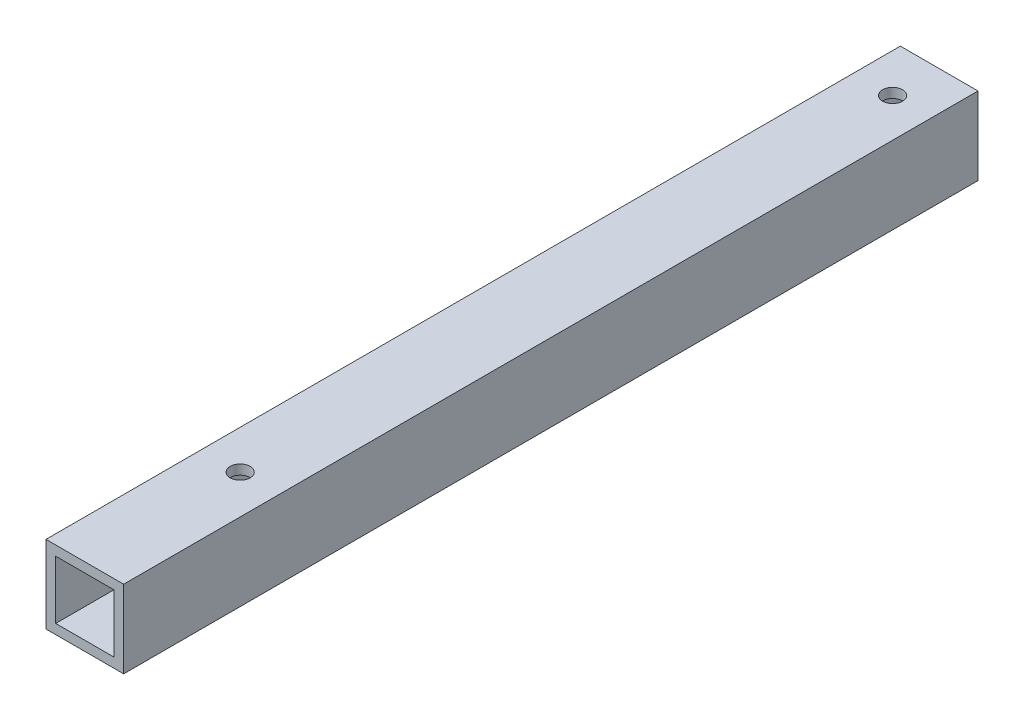
ISO-10303-21;
HEADER;
FILE_DESCRIPTION(('STEP AP214'),'2;1');
FILE_NAME('part.step','',(''),(''),'','','');
FILE_SCHEMA(('AUTOMOTIVE_DESIGN { 1 0 10303 214 1 1 1 1 }'));
ENDSEC;
DATA;
#1=APPLICATION_CONTEXT('core data for automotive mechanical design processes');
#2=APPLICATION_PROTOCOL_DEFINITION('international standard','automotive_design',2000,#1);
#3=PRODUCT_CONTEXT('',#1,'mechanical');
#4=PRODUCT('Part','Part','',(#3));
#5=PRODUCT_RELATED_PRODUCT_CATEGORY('part','',(#4));
#6=PRODUCT_DEFINITION_FORMATION('','',#4);
#7=PRODUCT_DEFINITION_CONTEXT('part definition',#1,'design');
#8=PRODUCT_DEFINITION('design','',#6,#7);
#9=PRODUCT_DEFINITION_SHAPE('','',#8);
#10=(LENGTH_UNIT() NAMED_UNIT(*) SI_UNIT(.MILLI.,.METRE.));
#11=(NAMED_UNIT(*) PLANE_ANGLE_UNIT() SI_UNIT($,.RADIAN.));
#12=(NAMED_UNIT(*) SI_UNIT($,.STERADIAN.) SOLID_ANGLE_UNIT());
#13=UNCERTAINTY_MEASURE_WITH_UNIT(LENGTH_MEASURE(1.E-05),#10,'distance_accuracy_value','');
#14=(GEOMETRIC_REPRESENTATION_CONTEXT(3) GLOBAL_UNCERTAINTY_ASSIGNED_CONTEXT((#13)) GLOBAL_UNIT_ASSIGNED_CONTEXT((#10,
#11,#12)) REPRESENTATION_CONTEXT('',''));
#15=CARTESIAN_POINT('',(0.,0.,0.));
#16=DIRECTION('',(0.,0.,1.));
#17=DIRECTION('',(1.,0.,0.));
#18=AXIS2_PLACEMENT_3D('',#15,#16,#17);
#19=CARTESIAN_POINT('',(0.,0.,279.4));
#20=DIRECTION('',(0.,0.,-1.));
#21=DIRECTION('',(-1.,0.,0.));
#22=AXIS2_PLACEMENT_3D('',#19,#20,#21);
#23=PLANE('',#22);
#24=DIRECTION('',(-1.,0.,0.));
#25=VECTOR('',#24,1.);
#26=CARTESIAN_POINT('',(12.7000000000001,-12.7,279.4));
#27=LINE('',#26,#25);
#28=CARTESIAN_POINT('',(12.7000000000001,-12.7,279.4));
#29=VERTEX_POINT('',#28);
#30=CARTESIAN_POINT('',(-12.6999999999999,-12.7,279.4));
#31=VERTEX_POINT('',#30);
#32=EDGE_CURVE('E140',#29,#31,#27,.T.);
#33=ORIENTED_EDGE('',*,*,#32,.F.);
#34=DIRECTION('',(0.,1.,0.));
#35=VECTOR('',#34,1.);
#36=CARTESIAN_POINT('',(12.7000000000001,-12.7,279.4));
#37=LINE('',#36,#35);
#38=CARTESIAN_POINT('',(12.7000000000001,12.7,279.4));
#39=VERTEX_POINT('',#38);
#40=EDGE_CURVE('E149',#29,#39,#37,.T.);
#41=ORIENTED_EDGE('',*,*,#40,.T.);
#42=DIRECTION('',(-1.,0.,0.));
#43=VECTOR('',#42,1.);
#44=CARTESIAN_POINT('',(12.7000000000001,12.7,279.4));
#45=LINE('',#44,#43);
#46=CARTESIAN_POINT('',(-12.6999999999999,12.7,279.4));
#47=VERTEX_POINT('',#46);
#48=EDGE_CURVE('E147',#39,#47,#45,.T.);
#49=ORIENTED_EDGE('',*,*,#48,.T.);
#50=DIRECTION('',(0.,1.,0.));
#51=VECTOR('',#50,1.);
#52=CARTESIAN_POINT('',(-12.6999999999999,-12.7,279.4));
#53=LINE('',#52,#51);
#54=EDGE_CURVE('E143',#31,#47,#53,.T.);
#55=ORIENTED_EDGE('',*,*,#54,.F.);
#56=EDGE_LOOP('',(#33,#41,#49,#55));
#57=FACE_BOUND('',#56,.T.);
#58=DIRECTION('',(0.,1.,0.));
#59=VECTOR('',#58,1.);
#60=CARTESIAN_POINT('',(9.52500000000005,-9.52499999999999,279.4));
#61=LINE('',#60,#59);
#62=CARTESIAN_POINT('',(9.52500000000005,-9.52499999999999,279.4));
#63=VERTEX_POINT('',#62);
#64=CARTESIAN_POINT('',(9.52500000000005,9.52499999999999,279.4));
#65=VERTEX_POINT('',#64);
#66=EDGE_CURVE('E102',#63,#65,#61,.T.);
#67=ORIENTED_EDGE('',*,*,#66,.F.);
#68=DIRECTION('',(1.,0.,0.));
#69=VECTOR('',#68,1.);
#70=CARTESIAN_POINT('',(-9.52500000000006,-9.52499999999999,279.4));
#71=LINE('',#70,#69);
#72=CARTESIAN_POINT('',(-9.52500000000006,-9.52499999999999,279.4));
#73=VERTEX_POINT('',#72);
#74=EDGE_CURVE('E124',#73,#63,#71,.T.);
#75=ORIENTED_EDGE('',*,*,#74,.F.);
#76=DIRECTION('',(0.,-1.,0.));
#77=VECTOR('',#76,1.);
#78=CARTESIAN_POINT('',(-9.52500000000006,-9.52499999999999,279.4));
#79=LINE('',#78,#77);
#80=CARTESIAN_POINT('',(-9.52500000000006,9.52499999999999,279.4));
#81=VERTEX_POINT('',#80);
#82=EDGE_CURVE('E122',#81,#73,#79,.T.);
#83=ORIENTED_EDGE('',*,*,#82,.F.);
#84=DIRECTION('',(-1.,0.,0.));
#85=VECTOR('',#84,1.);
#86=CARTESIAN_POINT('',(-9.52500000000006,9.52499999999999,279.4));
#87=LINE('',#86,#85);
#88=EDGE_CURVE('E110',#65,#81,#87,.T.);
#89=ORIENTED_EDGE('',*,*,#88,.F.);
#90=EDGE_LOOP('',(#67,#75,#83,#89));
#91=FACE_BOUND('',#90,.T.);
#92=ADVANCED_FACE('F36',(#57,#91),#23,.F.);
#93=CARTESIAN_POINT('',(0.,0.,0.));
#94=DIRECTION('',(0.,0.,-1.));
#95=DIRECTION('',(-1.,0.,0.));
#96=AXIS2_PLACEMENT_3D('',#93,#94,#95);
#97=PLANE('',#96);
#98=DIRECTION('',(-1.,0.,0.));
#99=VECTOR('',#98,1.);
#100=CARTESIAN_POINT('',(12.7000000000001,-12.7,0.));
#101=LINE('',#100,#99);
#102=CARTESIAN_POINT('',(12.7000000000001,-12.7,0.));
#103=VERTEX_POINT('',#102);
#104=CARTESIAN_POINT('',(-12.6999999999999,-12.7,0.));
#105=VERTEX_POINT('',#104);
#106=EDGE_CURVE('E118',#103,#105,#101,.T.);
#107=ORIENTED_EDGE('',*,*,#106,.T.);
#108=DIRECTION('',(0.,1.,0.));
#109=VECTOR('',#108,1.);
#110=CARTESIAN_POINT('',(-12.6999999999999,-12.7,0.));
#111=LINE('',#110,#109);
#112=CARTESIAN_POINT('',(-12.6999999999999,12.7,0.));
#113=VERTEX_POINT('',#112);
#114=EDGE_CURVE('E154',#105,#113,#111,.T.);
#115=ORIENTED_EDGE('',*,*,#114,.T.);
#116=DIRECTION('',(-1.,0.,0.));
#117=VECTOR('',#116,1.);
#118=CARTESIAN_POINT('',(12.7000000000001,12.7,0.));
#119=LINE('',#118,#117);
#120=CARTESIAN_POINT('',(12.7000000000001,12.7,0.));
#121=VERTEX_POINT('',#120);
#122=EDGE_CURVE('E157',#121,#113,#119,.T.);
#123=ORIENTED_EDGE('',*,*,#122,.F.);
#124=DIRECTION('',(0.,1.,0.));
#125=VECTOR('',#124,1.);
#126=CARTESIAN_POINT('',(12.7000000000001,-12.7,0.));
#127=LINE('',#126,#125);
#128=EDGE_CURVE('E144',#103,#121,#127,.T.);
#129=ORIENTED_EDGE('',*,*,#128,.F.);
#130=EDGE_LOOP('',(#107,#115,#123,#129));
#131=FACE_BOUND('',#130,.T.);
#132=DIRECTION('',(1.,0.,0.));
#133=VECTOR('',#132,1.);
#134=CARTESIAN_POINT('',(-9.52500000000006,-9.52499999999999,0.));
#135=LINE('',#134,#133);
#136=CARTESIAN_POINT('',(-9.52500000000006,-9.52499999999999,0.));
#137=VERTEX_POINT('',#136);
#138=CARTESIAN_POINT('',(9.52500000000005,-9.52499999999999,0.));
#139=VERTEX_POINT('',#138);
#140=EDGE_CURVE('E111',#137,#139,#135,.T.);
#141=ORIENTED_EDGE('',*,*,#140,.T.);
#142=DIRECTION('',(0.,1.,0.));
#143=VECTOR('',#142,1.);
#144=CARTESIAN_POINT('',(9.52500000000005,-9.52499999999999,0.));
#145=LINE('',#144,#143);
#146=CARTESIAN_POINT('',(9.52500000000005,9.52499999999999,0.));
#147=VERTEX_POINT('',#146);
#148=EDGE_CURVE('E61',#139,#147,#145,.T.);
#149=ORIENTED_EDGE('',*,*,#148,.T.);
#150=DIRECTION('',(-1.,0.,0.));
#151=VECTOR('',#150,1.);
#152=CARTESIAN_POINT('',(-9.52500000000006,9.52499999999999,0.));
#153=LINE('',#152,#151);
#154=CARTESIAN_POINT('',(-9.52500000000006,9.52499999999999,0.));
#155=VERTEX_POINT('',#154);
#156=EDGE_CURVE('E117',#147,#155,#153,.T.);
#157=ORIENTED_EDGE('',*,*,#156,.T.);
#158=DIRECTION('',(0.,-1.,0.));
#159=VECTOR('',#158,1.);
#160=CARTESIAN_POINT('',(-9.52500000000006,-9.52499999999999,0.));
#161=LINE('',#160,#159);
#162=EDGE_CURVE('E132',#155,#137,#161,.T.);
#163=ORIENTED_EDGE('',*,*,#162,.T.);
#164=EDGE_LOOP('',(#141,#149,#157,#163));
#165=FACE_BOUND('',#164,.T.);
#166=ADVANCED_FACE('F203',(#131,#165),#97,.T.);
#167=CARTESIAN_POINT('',(12.7000000000001,-12.7,279.4));
#168=DIRECTION('',(0.,-1.,0.));
#169=DIRECTION('',(0.,0.,-1.));
#170=AXIS2_PLACEMENT_3D('',#167,#168,#169);
#171=PLANE('',#170);
#172=CARTESIAN_POINT('',(0.,-12.7,228.6));
#173=DIRECTION('',(0.,1.,0.));
#174=DIRECTION('',(0.,0.,1.));
#175=AXIS2_PLACEMENT_3D('',#172,#173,#174);
#176=CIRCLE('',#175,3.2639);
#177=CARTESIAN_POINT('',(0.,-12.7,231.8639));
#178=VERTEX_POINT('',#177);
#179=EDGE_CURVE('E185',#178,#178,#176,.T.);
#180=ORIENTED_EDGE('',*,*,#179,.T.);
#181=EDGE_LOOP('',(#180));
#182=FACE_BOUND('',#181,.T.);
#183=CARTESIAN_POINT('',(0.,-12.7,15.24));
#184=DIRECTION('',(0.,1.,0.));
#185=DIRECTION('',(0.,0.,1.));
#186=AXIS2_PLACEMENT_3D('',#183,#184,#185);
#187=CIRCLE('',#186,3.2639);
#188=CARTESIAN_POINT('',(0.,-12.7,18.5039));
#189=VERTEX_POINT('',#188);
#190=EDGE_CURVE('E167',#189,#189,#187,.T.);
#191=ORIENTED_EDGE('',*,*,#190,.T.);
#192=EDGE_LOOP('',(#191));
#193=FACE_BOUND('',#192,.T.);
#194=ORIENTED_EDGE('',*,*,#106,.F.);
#195=DIRECTION('',(0.,0.,-1.));
#196=VECTOR('',#195,1.);
#197=CARTESIAN_POINT('',(12.7000000000001,-12.7,279.4));
#198=LINE('',#197,#196);
#199=EDGE_CURVE('E11',#29,#103,#198,.T.);
#200=ORIENTED_EDGE('',*,*,#199,.F.);
#201=ORIENTED_EDGE('',*,*,#32,.T.);
#202=DIRECTION('',(0.,0.,-1.));
#203=VECTOR('',#202,1.);
#204=CARTESIAN_POINT('',(-12.6999999999999,-12.7,279.4));
#205=LINE('',#204,#203);
#206=EDGE_CURVE('E151',#31,#105,#205,.T.);
#207=ORIENTED_EDGE('',*,*,#206,.T.);
#208=EDGE_LOOP('',(#194,#200,#201,#207));
#209=FACE_BOUND('',#208,.T.);
#210=ADVANCED_FACE('F38',(#182,#193,#209),#171,.T.);
#211=CARTESIAN_POINT('',(12.7000000000001,-12.7,279.4));
#212=DIRECTION('',(-1.,0.,0.));
#213=DIRECTION('',(0.,0.,1.));
#214=AXIS2_PLACEMENT_3D('',#211,#212,#213);
#215=PLANE('',#214);
#216=ORIENTED_EDGE('',*,*,#128,.T.);
#217=DIRECTION('',(0.,0.,-1.));
#218=VECTOR('',#217,1.);
#219=CARTESIAN_POINT('',(12.7000000000001,12.7,279.4));
#220=LINE('',#219,#218);
#221=EDGE_CURVE('E45',#39,#121,#220,.T.);
#222=ORIENTED_EDGE('',*,*,#221,.F.);
#223=ORIENTED_EDGE('',*,*,#40,.F.);
#224=ORIENTED_EDGE('',*,*,#199,.T.);
#225=EDGE_LOOP('',(#216,#222,#223,#224));
#226=FACE_BOUND('',#225,.T.);
#227=ADVANCED_FACE('F223',(#226),#215,.F.);
#228=CARTESIAN_POINT('',(12.7000000000001,12.7,279.4));
#229=DIRECTION('',(0.,-1.,0.));
#230=DIRECTION('',(0.,0.,-1.));
#231=AXIS2_PLACEMENT_3D('',#228,#229,#230);
#232=PLANE('',#231);
#233=CARTESIAN_POINT('',(0.,12.7,228.6));
#234=DIRECTION('',(0.,1.,0.));
#235=DIRECTION('',(0.,0.,1.));
#236=AXIS2_PLACEMENT_3D('',#233,#234,#235);
#237=CIRCLE('',#236,3.2639);
#238=CARTESIAN_POINT('',(0.,12.7,231.8639));
#239=VERTEX_POINT('',#238);
#240=EDGE_CURVE('E182',#239,#239,#237,.T.);
#241=ORIENTED_EDGE('',*,*,#240,.F.);
#242=EDGE_LOOP('',(#241));
#243=FACE_BOUND('',#242,.T.);
#244=CARTESIAN_POINT('',(0.,12.7,15.24));
#245=DIRECTION('',(0.,1.,0.));
#246=DIRECTION('',(0.,0.,1.));
#247=AXIS2_PLACEMENT_3D('',#244,#245,#246);
#248=CIRCLE('',#247,3.2639);
#249=CARTESIAN_POINT('',(0.,12.7,18.5039));
#250=VERTEX_POINT('',#249);
#251=EDGE_CURVE('E172',#250,#250,#248,.T.);
#252=ORIENTED_EDGE('',*,*,#251,.F.);
#253=EDGE_LOOP('',(#252));
#254=FACE_BOUND('',#253,.T.);
#255=ORIENTED_EDGE('',*,*,#122,.T.);
#256=DIRECTION('',(0.,0.,-1.));
#257=VECTOR('',#256,1.);
#258=CARTESIAN_POINT('',(-12.6999999999999,12.7,279.4));
#259=LINE('',#258,#257);
#260=EDGE_CURVE('E163',#47,#113,#259,.T.);
#261=ORIENTED_EDGE('',*,*,#260,.F.);
#262=ORIENTED_EDGE('',*,*,#48,.F.);
#263=ORIENTED_EDGE('',*,*,#221,.T.);
#264=EDGE_LOOP('',(#255,#261,#262,#263));
#265=FACE_BOUND('',#264,.T.);
#266=ADVANCED_FACE('F226',(#243,#254,#265),#232,.F.);
#267=CARTESIAN_POINT('',(-12.6999999999999,-12.7,279.4));
#268=DIRECTION('',(-1.,0.,0.));
#269=DIRECTION('',(0.,0.,1.));
#270=AXIS2_PLACEMENT_3D('',#267,#268,#269);
#271=PLANE('',#270);
#272=ORIENTED_EDGE('',*,*,#114,.F.);
#273=ORIENTED_EDGE('',*,*,#206,.F.);
#274=ORIENTED_EDGE('',*,*,#54,.T.);
#275=ORIENTED_EDGE('',*,*,#260,.T.);
#276=EDGE_LOOP('',(#272,#273,#274,#275));
#277=FACE_BOUND('',#276,.T.);
#278=ADVANCED_FACE('F229',(#277),#271,.T.);
#279=CARTESIAN_POINT('',(9.52500000000005,-9.52499999999999,279.4));
#280=DIRECTION('',(-1.,0.,0.));
#281=DIRECTION('',(0.,0.,1.));
#282=AXIS2_PLACEMENT_3D('',#279,#280,#281);
#283=PLANE('',#282);
#284=ORIENTED_EDGE('',*,*,#148,.F.);
#285=DIRECTION('',(0.,0.,-1.));
#286=VECTOR('',#285,1.);
#287=CARTESIAN_POINT('',(9.52500000000005,-9.52499999999999,279.4));
#288=LINE('',#287,#286);
#289=EDGE_CURVE('E106',#63,#139,#288,.T.);
#290=ORIENTED_EDGE('',*,*,#289,.F.);
#291=ORIENTED_EDGE('',*,*,#66,.T.);
#292=DIRECTION('',(0.,0.,-1.));
#293=VECTOR('',#292,1.);
#294=CARTESIAN_POINT('',(9.52500000000005,9.52499999999999,279.4));
#295=LINE('',#294,#293);
#296=EDGE_CURVE('E105',#65,#147,#295,.T.);
#297=ORIENTED_EDGE('',*,*,#296,.T.);
#298=EDGE_LOOP('',(#284,#290,#291,#297));
#299=FACE_BOUND('',#298,.T.);
#300=ADVANCED_FACE('F104',(#299),#283,.T.);
#301=CARTESIAN_POINT('',(-9.52500000000006,9.52499999999999,279.4));
#302=DIRECTION('',(0.,-1.,0.));
#303=DIRECTION('',(0.,0.,-1.));
#304=AXIS2_PLACEMENT_3D('',#301,#302,#303);
#305=PLANE('',#304);
#306=CARTESIAN_POINT('',(0.,9.52499999999999,228.6));
#307=DIRECTION('',(0.,-1.,0.));
#308=DIRECTION('',(0.,0.,-1.));
#309=AXIS2_PLACEMENT_3D('',#306,#307,#308);
#310=CIRCLE('',#309,3.2639);
#311=CARTESIAN_POINT('',(0.,9.52499999999999,225.3361));
#312=VERTEX_POINT('',#311);
#313=EDGE_CURVE('E177',#312,#312,#310,.T.);
#314=ORIENTED_EDGE('',*,*,#313,.F.);
#315=EDGE_LOOP('',(#314));
#316=FACE_BOUND('',#315,.T.);
#317=CARTESIAN_POINT('',(0.,9.52499999999999,15.24));
#318=DIRECTION('',(0.,-1.,0.));
#319=DIRECTION('',(0.,0.,-1.));
#320=AXIS2_PLACEMENT_3D('',#317,#318,#319);
#321=CIRCLE('',#320,3.2639);
#322=CARTESIAN_POINT('',(0.,9.52499999999999,11.9761));
#323=VERTEX_POINT('',#322);
#324=EDGE_CURVE('E130',#323,#323,#321,.T.);
#325=ORIENTED_EDGE('',*,*,#324,.F.);
#326=EDGE_LOOP('',(#325));
#327=FACE_BOUND('',#326,.T.);
#328=ORIENTED_EDGE('',*,*,#156,.F.);
#329=ORIENTED_EDGE('',*,*,#296,.F.);
#330=ORIENTED_EDGE('',*,*,#88,.T.);
#331=DIRECTION('',(0.,0.,-1.));
#332=VECTOR('',#331,1.);
#333=CARTESIAN_POINT('',(-9.52500000000006,9.52499999999999,279.4));
#334=LINE('',#333,#332);
#335=EDGE_CURVE('E119',#81,#155,#334,.T.);
#336=ORIENTED_EDGE('',*,*,#335,.T.);
#337=EDGE_LOOP('',(#328,#329,#330,#336));
#338=FACE_BOUND('',#337,.T.);
#339=ADVANCED_FACE('F114',(#316,#327,#338),#305,.T.);
#340=CARTESIAN_POINT('',(-9.52500000000006,-9.52499999999999,279.4));
#341=DIRECTION('',(1.,0.,0.));
#342=DIRECTION('',(0.,0.,-1.));
#343=AXIS2_PLACEMENT_3D('',#340,#341,#342);
#344=PLANE('',#343);
#345=ORIENTED_EDGE('',*,*,#162,.F.);
#346=ORIENTED_EDGE('',*,*,#335,.F.);
#347=ORIENTED_EDGE('',*,*,#82,.T.);
#348=DIRECTION('',(0.,0.,-1.));
#349=VECTOR('',#348,1.);
#350=CARTESIAN_POINT('',(-9.52500000000006,-9.52499999999999,279.4));
#351=LINE('',#350,#349);
#352=EDGE_CURVE('E53',#73,#137,#351,.T.);
#353=ORIENTED_EDGE('',*,*,#352,.T.);
#354=EDGE_LOOP('',(#345,#346,#347,#353));
#355=FACE_BOUND('',#354,.T.);
#356=ADVANCED_FACE('F199',(#355),#344,.T.);
#357=CARTESIAN_POINT('',(-9.52500000000006,-9.52499999999999,279.4));
#358=DIRECTION('',(0.,1.,0.));
#359=DIRECTION('',(0.,0.,1.));
#360=AXIS2_PLACEMENT_3D('',#357,#358,#359);
#361=PLANE('',#360);
#362=CARTESIAN_POINT('',(0.,-9.52499999999999,228.6));
#363=DIRECTION('',(0.,1.,0.));
#364=DIRECTION('',(0.,0.,1.));
#365=AXIS2_PLACEMENT_3D('',#362,#363,#364);
#366=CIRCLE('',#365,3.2639);
#367=CARTESIAN_POINT('',(0.,-9.52499999999999,231.8639));
#368=VERTEX_POINT('',#367);
#369=EDGE_CURVE('E40',#368,#368,#366,.T.);
#370=ORIENTED_EDGE('',*,*,#369,.F.);
#371=EDGE_LOOP('',(#370));
#372=FACE_BOUND('',#371,.T.);
#373=CARTESIAN_POINT('',(0.,-9.52499999999999,15.24));
#374=DIRECTION('',(0.,1.,0.));
#375=DIRECTION('',(0.,0.,1.));
#376=AXIS2_PLACEMENT_3D('',#373,#374,#375);
#377=CIRCLE('',#376,3.2639);
#378=CARTESIAN_POINT('',(0.,-9.52499999999999,18.5039));
#379=VERTEX_POINT('',#378);
#380=EDGE_CURVE('E165',#379,#379,#377,.T.);
#381=ORIENTED_EDGE('',*,*,#380,.F.);
#382=EDGE_LOOP('',(#381));
#383=FACE_BOUND('',#382,.T.);
#384=ORIENTED_EDGE('',*,*,#140,.F.);
#385=ORIENTED_EDGE('',*,*,#352,.F.);
#386=ORIENTED_EDGE('',*,*,#74,.T.);
#387=ORIENTED_EDGE('',*,*,#289,.T.);
#388=EDGE_LOOP('',(#384,#385,#386,#387));
#389=FACE_BOUND('',#388,.T.);
#390=ADVANCED_FACE('F195',(#372,#383,#389),#361,.T.);
#391=CARTESIAN_POINT('',(0.,-12.7,15.24));
#392=DIRECTION('',(0.,1.,0.));
#393=DIRECTION('',(0.,0.,1.));
#394=AXIS2_PLACEMENT_3D('',#391,#392,#393);
#395=CYLINDRICAL_SURFACE('',#394,3.2639);
#396=ORIENTED_EDGE('',*,*,#380,.T.);
#397=EDGE_LOOP('',(#396));
#398=FACE_BOUND('',#397,.T.);
#399=ORIENTED_EDGE('',*,*,#190,.F.);
#400=EDGE_LOOP('',(#399));
#401=FACE_BOUND('',#400,.T.);
#402=ADVANCED_FACE('F198',(#398,#401),#395,.F.);
#403=ORIENTED_EDGE('',*,*,#324,.T.);
#404=EDGE_LOOP('',(#403));
#405=FACE_BOUND('',#404,.T.);
#406=ORIENTED_EDGE('',*,*,#251,.T.);
#407=EDGE_LOOP('',(#406));
#408=FACE_BOUND('',#407,.T.);
#409=ADVANCED_FACE('F288',(#405,#408),#395,.F.);
#410=CARTESIAN_POINT('',(0.,-12.7,228.6));
#411=DIRECTION('',(0.,1.,0.));
#412=DIRECTION('',(0.,0.,1.));
#413=AXIS2_PLACEMENT_3D('',#410,#411,#412);
#414=CYLINDRICAL_SURFACE('',#413,3.2639);
#415=ORIENTED_EDGE('',*,*,#369,.T.);
#416=EDGE_LOOP('',(#415));
#417=FACE_BOUND('',#416,.T.);
#418=ORIENTED_EDGE('',*,*,#179,.F.);
#419=EDGE_LOOP('',(#418));
#420=FACE_BOUND('',#419,.T.);
#421=ADVANCED_FACE('F192',(#417,#420),#414,.F.);
#422=ORIENTED_EDGE('',*,*,#313,.T.);
#423=EDGE_LOOP('',(#422));
#424=FACE_BOUND('',#423,.T.);
#425=ORIENTED_EDGE('',*,*,#240,.T.);
#426=EDGE_LOOP('',(#425));
#427=FACE_BOUND('',#426,.T.);
#428=ADVANCED_FACE('F287',(#424,#427),#414,.F.);
#429=CLOSED_SHELL('',(#92,#166,#210,#227,#266,#278,#300,#339,#356,#390,#402,#409,#421,#428));
#430=MANIFOLD_SOLID_BREP('B2',#429);
#431=ADVANCED_BREP_SHAPE_REPRESENTATION('',(#18,#430),#14);
#432=SHAPE_DEFINITION_REPRESENTATION(#9,#431);
ENDSEC;
END-ISO-10303-21;
